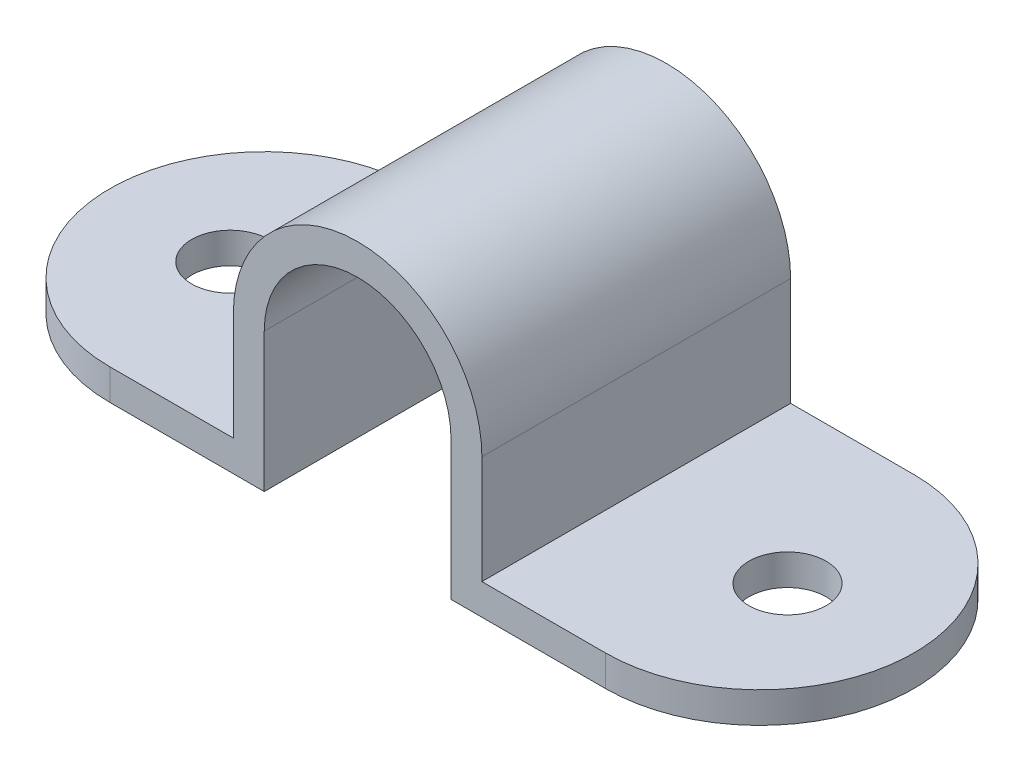
ISO-10303-21;
HEADER;
FILE_DESCRIPTION(('STEP AP214'),'2;1');
FILE_NAME('part.step','',(''),(''),'','','');
FILE_SCHEMA(('AUTOMOTIVE_DESIGN { 1 0 10303 214 1 1 1 1 }'));
ENDSEC;
DATA;
#1=APPLICATION_CONTEXT('core data for automotive mechanical design processes');
#2=APPLICATION_PROTOCOL_DEFINITION('international standard','automotive_design',2000,#1);
#3=PRODUCT_CONTEXT('',#1,'mechanical');
#4=PRODUCT('Part','Part','',(#3));
#5=PRODUCT_RELATED_PRODUCT_CATEGORY('part','',(#4));
#6=PRODUCT_DEFINITION_FORMATION('','',#4);
#7=PRODUCT_DEFINITION_CONTEXT('part definition',#1,'design');
#8=PRODUCT_DEFINITION('design','',#6,#7);
#9=PRODUCT_DEFINITION_SHAPE('','',#8);
#10=(LENGTH_UNIT() NAMED_UNIT(*) SI_UNIT(.MILLI.,.METRE.));
#11=(NAMED_UNIT(*) PLANE_ANGLE_UNIT() SI_UNIT($,.RADIAN.));
#12=(NAMED_UNIT(*) SI_UNIT($,.STERADIAN.) SOLID_ANGLE_UNIT());
#13=UNCERTAINTY_MEASURE_WITH_UNIT(LENGTH_MEASURE(1.E-05),#10,'distance_accuracy_value','');
#14=(GEOMETRIC_REPRESENTATION_CONTEXT(3) GLOBAL_UNCERTAINTY_ASSIGNED_CONTEXT((#13)) GLOBAL_UNIT_ASSIGNED_CONTEXT((#10,
#11,#12)) REPRESENTATION_CONTEXT('',''));
#15=CARTESIAN_POINT('',(0.,0.,0.));
#16=DIRECTION('',(0.,0.,1.));
#17=DIRECTION('',(1.,0.,0.));
#18=AXIS2_PLACEMENT_3D('',#15,#16,#17);
#19=CARTESIAN_POINT('',(-6.05,-9.,20.));
#20=DIRECTION('',(0.,1.,0.));
#21=DIRECTION('',(-1.,0.,0.));
#22=AXIS2_PLACEMENT_3D('',#19,#20,#21);
#23=PLANE('',#22);
#24=CARTESIAN_POINT('',(-18.05,-9.,10.2020410288673));
#25=DIRECTION('',(0.,1.,0.));
#26=DIRECTION('',(-1.,0.,0.));
#27=AXIS2_PLACEMENT_3D('',#24,#25,#26);
#28=CIRCLE('',#27,2.5);
#29=CARTESIAN_POINT('',(-20.55,-9.,10.2020410288673));
#30=VERTEX_POINT('',#29);
#31=EDGE_CURVE('E243',#30,#30,#28,.T.);
#32=ORIENTED_EDGE('',*,*,#31,.T.);
#33=EDGE_LOOP('',(#32));
#34=FACE_BOUND('',#33,.T.);
#35=DIRECTION('',(1.,0.,0.));
#36=VECTOR('',#35,1.);
#37=CARTESIAN_POINT('',(-6.05,-9.,0.));
#38=LINE('',#37,#36);
#39=CARTESIAN_POINT('',(-16.05,-9.,0.));
#40=VERTEX_POINT('',#39);
#41=CARTESIAN_POINT('',(-6.05,-9.,0.));
#42=VERTEX_POINT('',#41);
#43=EDGE_CURVE('E149',#40,#42,#38,.T.);
#44=ORIENTED_EDGE('',*,*,#43,.T.);
#45=DIRECTION('',(0.,0.,-1.));
#46=VECTOR('',#45,1.);
#47=CARTESIAN_POINT('',(-6.05,-9.,20.));
#48=LINE('',#47,#46);
#49=CARTESIAN_POINT('',(-6.05,-9.,20.));
#50=VERTEX_POINT('',#49);
#51=EDGE_CURVE('E11',#50,#42,#48,.T.);
#52=ORIENTED_EDGE('',*,*,#51,.F.);
#53=DIRECTION('',(1.,0.,0.));
#54=VECTOR('',#53,1.);
#55=CARTESIAN_POINT('',(-6.05,-9.,20.));
#56=LINE('',#55,#54);
#57=CARTESIAN_POINT('',(-16.05,-9.,20.));
#58=VERTEX_POINT('',#57);
#59=EDGE_CURVE('E174',#58,#50,#56,.T.);
#60=ORIENTED_EDGE('',*,*,#59,.F.);
#61=CARTESIAN_POINT('',(-16.05,-9.,10.));
#62=DIRECTION('',(0.,-1.,0.));
#63=DIRECTION('',(0.,0.,-1.));
#64=AXIS2_PLACEMENT_3D('',#61,#62,#63);
#65=CIRCLE('',#64,10.);
#66=EDGE_CURVE('E237',#58,#40,#65,.T.);
#67=ORIENTED_EDGE('',*,*,#66,.T.);
#68=EDGE_LOOP('',(#44,#52,#60,#67));
#69=FACE_BOUND('',#68,.T.);
#70=ADVANCED_FACE('F36',(#34,#69),#23,.F.);
#71=CARTESIAN_POINT('',(-6.05,0.,20.));
#72=DIRECTION('',(-1.,0.,0.));
#73=DIRECTION('',(0.,-1.,0.));
#74=AXIS2_PLACEMENT_3D('',#71,#72,#73);
#75=PLANE('',#74);
#76=DIRECTION('',(0.,1.,0.));
#77=VECTOR('',#76,1.);
#78=CARTESIAN_POINT('',(-6.05,0.,0.));
#79=LINE('',#78,#77);
#80=CARTESIAN_POINT('',(-6.05,0.,0.));
#81=VERTEX_POINT('',#80);
#82=EDGE_CURVE('E152',#42,#81,#79,.T.);
#83=ORIENTED_EDGE('',*,*,#82,.T.);
#84=DIRECTION('',(0.,0.,-1.));
#85=VECTOR('',#84,1.);
#86=CARTESIAN_POINT('',(-6.05,0.,20.));
#87=LINE('',#86,#85);
#88=CARTESIAN_POINT('',(-6.05,0.,20.));
#89=VERTEX_POINT('',#88);
#90=EDGE_CURVE('E44',#89,#81,#87,.T.);
#91=ORIENTED_EDGE('',*,*,#90,.F.);
#92=DIRECTION('',(0.,1.,0.));
#93=VECTOR('',#92,1.);
#94=CARTESIAN_POINT('',(-6.05,0.,20.));
#95=LINE('',#94,#93);
#96=EDGE_CURVE('E103',#50,#89,#95,.T.);
#97=ORIENTED_EDGE('',*,*,#96,.F.);
#98=ORIENTED_EDGE('',*,*,#51,.T.);
#99=EDGE_LOOP('',(#83,#91,#97,#98));
#100=FACE_BOUND('',#99,.T.);
#101=ADVANCED_FACE('F252',(#100),#75,.F.);
#102=CARTESIAN_POINT('',(0.,0.,20.));
#103=DIRECTION('',(0.,0.,-1.));
#104=DIRECTION('',(-1.,0.,0.));
#105=AXIS2_PLACEMENT_3D('',#102,#103,#104);
#106=CYLINDRICAL_SURFACE('',#105,6.05);
#107=CARTESIAN_POINT('',(0.,0.,0.));
#108=DIRECTION('',(0.,0.,-1.));
#109=DIRECTION('',(1.,0.,0.));
#110=AXIS2_PLACEMENT_3D('',#107,#108,#109);
#111=CIRCLE('',#110,6.05);
#112=CARTESIAN_POINT('',(6.05,0.,0.));
#113=VERTEX_POINT('',#112);
#114=EDGE_CURVE('E155',#81,#113,#111,.T.);
#115=ORIENTED_EDGE('',*,*,#114,.T.);
#116=DIRECTION('',(0.,0.,-1.));
#117=VECTOR('',#116,1.);
#118=CARTESIAN_POINT('',(6.05,0.,20.));
#119=LINE('',#118,#117);
#120=CARTESIAN_POINT('',(6.05,0.,20.));
#121=VERTEX_POINT('',#120);
#122=EDGE_CURVE('E186',#121,#113,#119,.T.);
#123=ORIENTED_EDGE('',*,*,#122,.F.);
#124=CARTESIAN_POINT('',(0.,0.,20.));
#125=DIRECTION('',(0.,0.,-1.));
#126=DIRECTION('',(1.,0.,0.));
#127=AXIS2_PLACEMENT_3D('',#124,#125,#126);
#128=CIRCLE('',#127,6.05);
#129=EDGE_CURVE('E194',#89,#121,#128,.T.);
#130=ORIENTED_EDGE('',*,*,#129,.F.);
#131=ORIENTED_EDGE('',*,*,#90,.T.);
#132=EDGE_LOOP('',(#115,#123,#130,#131));
#133=FACE_BOUND('',#132,.T.);
#134=ADVANCED_FACE('F192',(#133),#106,.F.);
#135=CARTESIAN_POINT('',(6.05,0.,20.));
#136=DIRECTION('',(1.,0.,0.));
#137=DIRECTION('',(0.,1.,0.));
#138=AXIS2_PLACEMENT_3D('',#135,#136,#137);
#139=PLANE('',#138);
#140=DIRECTION('',(0.,-1.,0.));
#141=VECTOR('',#140,1.);
#142=CARTESIAN_POINT('',(6.05,0.,0.));
#143=LINE('',#142,#141);
#144=CARTESIAN_POINT('',(6.05,-9.,0.));
#145=VERTEX_POINT('',#144);
#146=EDGE_CURVE('E157',#113,#145,#143,.T.);
#147=ORIENTED_EDGE('',*,*,#146,.T.);
#148=DIRECTION('',(0.,0.,-1.));
#149=VECTOR('',#148,1.);
#150=CARTESIAN_POINT('',(6.05,-9.,20.));
#151=LINE('',#150,#149);
#152=CARTESIAN_POINT('',(6.05,-9.,20.));
#153=VERTEX_POINT('',#152);
#154=EDGE_CURVE('E183',#153,#145,#151,.T.);
#155=ORIENTED_EDGE('',*,*,#154,.F.);
#156=DIRECTION('',(0.,-1.,0.));
#157=VECTOR('',#156,1.);
#158=CARTESIAN_POINT('',(6.05,0.,20.));
#159=LINE('',#158,#157);
#160=EDGE_CURVE('E213',#121,#153,#159,.T.);
#161=ORIENTED_EDGE('',*,*,#160,.F.);
#162=ORIENTED_EDGE('',*,*,#122,.T.);
#163=EDGE_LOOP('',(#147,#155,#161,#162));
#164=FACE_BOUND('',#163,.T.);
#165=ADVANCED_FACE('F203',(#164),#139,.F.);
#166=CARTESIAN_POINT('',(6.05,-9.,20.));
#167=DIRECTION('',(0.,1.,0.));
#168=DIRECTION('',(-1.,0.,0.));
#169=AXIS2_PLACEMENT_3D('',#166,#167,#168);
#170=PLANE('',#169);
#171=CARTESIAN_POINT('',(18.05,-9.,10.2020410288673));
#172=DIRECTION('',(0.,1.,0.));
#173=DIRECTION('',(-1.,0.,0.));
#174=AXIS2_PLACEMENT_3D('',#171,#172,#173);
#175=CIRCLE('',#174,2.5);
#176=CARTESIAN_POINT('',(15.55,-9.,10.2020410288673));
#177=VERTEX_POINT('',#176);
#178=EDGE_CURVE('E238',#177,#177,#175,.T.);
#179=ORIENTED_EDGE('',*,*,#178,.T.);
#180=EDGE_LOOP('',(#179));
#181=FACE_BOUND('',#180,.T.);
#182=DIRECTION('',(1.,0.,0.));
#183=VECTOR('',#182,1.);
#184=CARTESIAN_POINT('',(6.05,-9.,0.));
#185=LINE('',#184,#183);
#186=CARTESIAN_POINT('',(16.05,-9.,0.));
#187=VERTEX_POINT('',#186);
#188=EDGE_CURVE('E159',#145,#187,#185,.T.);
#189=ORIENTED_EDGE('',*,*,#188,.T.);
#190=CARTESIAN_POINT('',(16.05,-9.,10.));
#191=DIRECTION('',(0.,1.,0.));
#192=DIRECTION('',(0.,0.,-1.));
#193=AXIS2_PLACEMENT_3D('',#190,#191,#192);
#194=CIRCLE('',#193,10.);
#195=CARTESIAN_POINT('',(16.05,-9.,20.));
#196=VERTEX_POINT('',#195);
#197=EDGE_CURVE('E153',#196,#187,#194,.T.);
#198=ORIENTED_EDGE('',*,*,#197,.F.);
#199=DIRECTION('',(1.,0.,0.));
#200=VECTOR('',#199,1.);
#201=CARTESIAN_POINT('',(6.05,-9.,20.));
#202=LINE('',#201,#200);
#203=EDGE_CURVE('E209',#153,#196,#202,.T.);
#204=ORIENTED_EDGE('',*,*,#203,.F.);
#205=ORIENTED_EDGE('',*,*,#154,.T.);
#206=EDGE_LOOP('',(#189,#198,#204,#205));
#207=FACE_BOUND('',#206,.T.);
#208=ADVANCED_FACE('F207',(#181,#207),#170,.F.);
#209=CARTESIAN_POINT('',(8.05,-7.,20.));
#210=DIRECTION('',(0.,-1.,0.));
#211=DIRECTION('',(0.,0.,-1.));
#212=AXIS2_PLACEMENT_3D('',#209,#210,#211);
#213=PLANE('',#212);
#214=CARTESIAN_POINT('',(18.05,-7.,10.2020410288673));
#215=DIRECTION('',(0.,1.,0.));
#216=DIRECTION('',(0.,0.,1.));
#217=AXIS2_PLACEMENT_3D('',#214,#215,#216);
#218=CIRCLE('',#217,2.5);
#219=CARTESIAN_POINT('',(18.05,-7.,12.7020410288673));
#220=VERTEX_POINT('',#219);
#221=EDGE_CURVE('E301',#220,#220,#218,.T.);
#222=ORIENTED_EDGE('',*,*,#221,.F.);
#223=EDGE_LOOP('',(#222));
#224=FACE_BOUND('',#223,.T.);
#225=DIRECTION('',(-1.,0.,0.));
#226=VECTOR('',#225,1.);
#227=CARTESIAN_POINT('',(8.05,-7.,0.));
#228=LINE('',#227,#226);
#229=CARTESIAN_POINT('',(16.05,-7.,0.));
#230=VERTEX_POINT('',#229);
#231=CARTESIAN_POINT('',(8.05,-7.,0.));
#232=VERTEX_POINT('',#231);
#233=EDGE_CURVE('E164',#230,#232,#228,.T.);
#234=ORIENTED_EDGE('',*,*,#233,.T.);
#235=DIRECTION('',(0.,0.,-1.));
#236=VECTOR('',#235,1.);
#237=CARTESIAN_POINT('',(8.05,-7.,20.));
#238=LINE('',#237,#236);
#239=CARTESIAN_POINT('',(8.05,-7.,20.));
#240=VERTEX_POINT('',#239);
#241=EDGE_CURVE('E180',#240,#232,#238,.T.);
#242=ORIENTED_EDGE('',*,*,#241,.F.);
#243=DIRECTION('',(-1.,0.,0.));
#244=VECTOR('',#243,1.);
#245=CARTESIAN_POINT('',(8.05,-7.,20.));
#246=LINE('',#245,#244);
#247=CARTESIAN_POINT('',(16.05,-7.,20.));
#248=VERTEX_POINT('',#247);
#249=EDGE_CURVE('E215',#248,#240,#246,.T.);
#250=ORIENTED_EDGE('',*,*,#249,.F.);
#251=CARTESIAN_POINT('',(16.05,-7.,10.));
#252=DIRECTION('',(0.,1.,0.));
#253=DIRECTION('',(0.,0.,-1.));
#254=AXIS2_PLACEMENT_3D('',#251,#252,#253);
#255=CIRCLE('',#254,10.);
#256=EDGE_CURVE('E240',#248,#230,#255,.T.);
#257=ORIENTED_EDGE('',*,*,#256,.T.);
#258=EDGE_LOOP('',(#234,#242,#250,#257));
#259=FACE_BOUND('',#258,.T.);
#260=ADVANCED_FACE('F265',(#224,#259),#213,.F.);
#261=CARTESIAN_POINT('',(8.05,0.,20.));
#262=DIRECTION('',(-1.,0.,0.));
#263=DIRECTION('',(0.,0.,1.));
#264=AXIS2_PLACEMENT_3D('',#261,#262,#263);
#265=PLANE('',#264);
#266=DIRECTION('',(0.,1.,0.));
#267=VECTOR('',#266,1.);
#268=CARTESIAN_POINT('',(8.05,0.,0.));
#269=LINE('',#268,#267);
#270=CARTESIAN_POINT('',(8.05,0.,0.));
#271=VERTEX_POINT('',#270);
#272=EDGE_CURVE('E166',#232,#271,#269,.T.);
#273=ORIENTED_EDGE('',*,*,#272,.T.);
#274=DIRECTION('',(0.,0.,-1.));
#275=VECTOR('',#274,1.);
#276=CARTESIAN_POINT('',(8.05,0.,20.));
#277=LINE('',#276,#275);
#278=CARTESIAN_POINT('',(8.05,0.,20.));
#279=VERTEX_POINT('',#278);
#280=EDGE_CURVE('E177',#279,#271,#277,.T.);
#281=ORIENTED_EDGE('',*,*,#280,.F.);
#282=DIRECTION('',(0.,1.,0.));
#283=VECTOR('',#282,1.);
#284=CARTESIAN_POINT('',(8.05,0.,20.));
#285=LINE('',#284,#283);
#286=EDGE_CURVE('E221',#240,#279,#285,.T.);
#287=ORIENTED_EDGE('',*,*,#286,.F.);
#288=ORIENTED_EDGE('',*,*,#241,.T.);
#289=EDGE_LOOP('',(#273,#281,#287,#288));
#290=FACE_BOUND('',#289,.T.);
#291=ADVANCED_FACE('F227',(#290),#265,.F.);
#292=CARTESIAN_POINT('',(0.,0.,20.));
#293=DIRECTION('',(0.,0.,-1.));
#294=DIRECTION('',(-1.,0.,0.));
#295=AXIS2_PLACEMENT_3D('',#292,#293,#294);
#296=CYLINDRICAL_SURFACE('',#295,8.05);
#297=CARTESIAN_POINT('',(0.,0.,0.));
#298=DIRECTION('',(0.,0.,1.));
#299=DIRECTION('',(1.,0.,0.));
#300=AXIS2_PLACEMENT_3D('',#297,#298,#299);
#301=CIRCLE('',#300,8.05);
#302=CARTESIAN_POINT('',(-8.05,0.,0.));
#303=VERTEX_POINT('',#302);
#304=EDGE_CURVE('E168',#271,#303,#301,.T.);
#305=ORIENTED_EDGE('',*,*,#304,.T.);
#306=DIRECTION('',(0.,0.,-1.));
#307=VECTOR('',#306,1.);
#308=CARTESIAN_POINT('',(-8.05,0.,20.));
#309=LINE('',#308,#307);
#310=CARTESIAN_POINT('',(-8.05,0.,20.));
#311=VERTEX_POINT('',#310);
#312=EDGE_CURVE('E140',#311,#303,#309,.T.);
#313=ORIENTED_EDGE('',*,*,#312,.F.);
#314=CARTESIAN_POINT('',(0.,0.,20.));
#315=DIRECTION('',(0.,0.,1.));
#316=DIRECTION('',(1.,0.,0.));
#317=AXIS2_PLACEMENT_3D('',#314,#315,#316);
#318=CIRCLE('',#317,8.05);
#319=EDGE_CURVE('E135',#279,#311,#318,.T.);
#320=ORIENTED_EDGE('',*,*,#319,.F.);
#321=ORIENTED_EDGE('',*,*,#280,.T.);
#322=EDGE_LOOP('',(#305,#313,#320,#321));
#323=FACE_BOUND('',#322,.T.);
#324=ADVANCED_FACE('F231',(#323),#296,.T.);
#325=CARTESIAN_POINT('',(-8.05,0.,20.));
#326=DIRECTION('',(1.,0.,0.));
#327=DIRECTION('',(0.,0.,-1.));
#328=AXIS2_PLACEMENT_3D('',#325,#326,#327);
#329=PLANE('',#328);
#330=DIRECTION('',(0.,-1.,0.));
#331=VECTOR('',#330,1.);
#332=CARTESIAN_POINT('',(-8.05,0.,0.));
#333=LINE('',#332,#331);
#334=CARTESIAN_POINT('',(-8.05,-7.,0.));
#335=VERTEX_POINT('',#334);
#336=EDGE_CURVE('E88',#303,#335,#333,.T.);
#337=ORIENTED_EDGE('',*,*,#336,.T.);
#338=DIRECTION('',(0.,0.,-1.));
#339=VECTOR('',#338,1.);
#340=CARTESIAN_POINT('',(-8.05,-7.,20.));
#341=LINE('',#340,#339);
#342=CARTESIAN_POINT('',(-8.05,-7.,20.));
#343=VERTEX_POINT('',#342);
#344=EDGE_CURVE('E138',#343,#335,#341,.T.);
#345=ORIENTED_EDGE('',*,*,#344,.F.);
#346=DIRECTION('',(0.,-1.,0.));
#347=VECTOR('',#346,1.);
#348=CARTESIAN_POINT('',(-8.05,0.,20.));
#349=LINE('',#348,#347);
#350=EDGE_CURVE('E130',#311,#343,#349,.T.);
#351=ORIENTED_EDGE('',*,*,#350,.F.);
#352=ORIENTED_EDGE('',*,*,#312,.T.);
#353=EDGE_LOOP('',(#337,#345,#351,#352));
#354=FACE_BOUND('',#353,.T.);
#355=ADVANCED_FACE('F139',(#354),#329,.F.);
#356=CARTESIAN_POINT('',(-8.05,-7.,20.));
#357=DIRECTION('',(0.,-1.,0.));
#358=DIRECTION('',(1.,0.,0.));
#359=AXIS2_PLACEMENT_3D('',#356,#357,#358);
#360=PLANE('',#359);
#361=CARTESIAN_POINT('',(-18.05,-7.,10.2020410288673));
#362=DIRECTION('',(0.,1.,0.));
#363=DIRECTION('',(0.,0.,1.));
#364=AXIS2_PLACEMENT_3D('',#361,#362,#363);
#365=CIRCLE('',#364,2.5);
#366=CARTESIAN_POINT('',(-18.05,-7.,12.7020410288673));
#367=VERTEX_POINT('',#366);
#368=EDGE_CURVE('E303',#367,#367,#365,.T.);
#369=ORIENTED_EDGE('',*,*,#368,.F.);
#370=EDGE_LOOP('',(#369));
#371=FACE_BOUND('',#370,.T.);
#372=DIRECTION('',(-1.,0.,0.));
#373=VECTOR('',#372,1.);
#374=CARTESIAN_POINT('',(-8.05,-7.,0.));
#375=LINE('',#374,#373);
#376=CARTESIAN_POINT('',(-16.05,-7.,0.));
#377=VERTEX_POINT('',#376);
#378=EDGE_CURVE('E95',#335,#377,#375,.T.);
#379=ORIENTED_EDGE('',*,*,#378,.T.);
#380=CARTESIAN_POINT('',(-16.05,-7.,10.));
#381=DIRECTION('',(0.,-1.,0.));
#382=DIRECTION('',(0.,0.,-1.));
#383=AXIS2_PLACEMENT_3D('',#380,#381,#382);
#384=CIRCLE('',#383,10.);
#385=CARTESIAN_POINT('',(-16.05,-7.,20.));
#386=VERTEX_POINT('',#385);
#387=EDGE_CURVE('E144',#386,#377,#384,.T.);
#388=ORIENTED_EDGE('',*,*,#387,.F.);
#389=DIRECTION('',(-1.,0.,0.));
#390=VECTOR('',#389,1.);
#391=CARTESIAN_POINT('',(-8.05,-7.,20.));
#392=LINE('',#391,#390);
#393=EDGE_CURVE('E133',#343,#386,#392,.T.);
#394=ORIENTED_EDGE('',*,*,#393,.F.);
#395=ORIENTED_EDGE('',*,*,#344,.T.);
#396=EDGE_LOOP('',(#379,#388,#394,#395));
#397=FACE_BOUND('',#396,.T.);
#398=ADVANCED_FACE('F142',(#371,#397),#360,.F.);
#399=CARTESIAN_POINT('',(0.,0.,20.));
#400=DIRECTION('',(0.,0.,1.));
#401=DIRECTION('',(1.,0.,0.));
#402=AXIS2_PLACEMENT_3D('',#399,#400,#401);
#403=PLANE('',#402);
#404=ORIENTED_EDGE('',*,*,#59,.T.);
#405=ORIENTED_EDGE('',*,*,#96,.T.);
#406=ORIENTED_EDGE('',*,*,#129,.T.);
#407=ORIENTED_EDGE('',*,*,#160,.T.);
#408=ORIENTED_EDGE('',*,*,#203,.T.);
#409=DIRECTION('',(0.,1.,0.));
#410=VECTOR('',#409,1.);
#411=CARTESIAN_POINT('',(16.05,-9.,20.));
#412=LINE('',#411,#410);
#413=EDGE_CURVE('E212',#196,#248,#412,.T.);
#414=ORIENTED_EDGE('',*,*,#413,.T.);
#415=ORIENTED_EDGE('',*,*,#249,.T.);
#416=ORIENTED_EDGE('',*,*,#286,.T.);
#417=ORIENTED_EDGE('',*,*,#319,.T.);
#418=ORIENTED_EDGE('',*,*,#350,.T.);
#419=ORIENTED_EDGE('',*,*,#393,.T.);
#420=DIRECTION('',(0.,-1.,0.));
#421=VECTOR('',#420,1.);
#422=CARTESIAN_POINT('',(-16.05,-9.,20.));
#423=LINE('',#422,#421);
#424=EDGE_CURVE('E52',#386,#58,#423,.T.);
#425=ORIENTED_EDGE('',*,*,#424,.T.);
#426=EDGE_LOOP('',(#404,#405,#406,#407,#408,#414,#415,#416,#417,#418,#419,#425));
#427=FACE_BOUND('',#426,.T.);
#428=ADVANCED_FACE('F131',(#427),#403,.T.);
#429=CARTESIAN_POINT('',(0.,0.,0.));
#430=DIRECTION('',(0.,0.,1.));
#431=DIRECTION('',(1.,0.,0.));
#432=AXIS2_PLACEMENT_3D('',#429,#430,#431);
#433=PLANE('',#432);
#434=ORIENTED_EDGE('',*,*,#43,.F.);
#435=DIRECTION('',(0.,-1.,0.));
#436=VECTOR('',#435,1.);
#437=CARTESIAN_POINT('',(-16.05,-9.,0.));
#438=LINE('',#437,#436);
#439=EDGE_CURVE('E172',#377,#40,#438,.T.);
#440=ORIENTED_EDGE('',*,*,#439,.F.);
#441=ORIENTED_EDGE('',*,*,#378,.F.);
#442=ORIENTED_EDGE('',*,*,#336,.F.);
#443=ORIENTED_EDGE('',*,*,#304,.F.);
#444=ORIENTED_EDGE('',*,*,#272,.F.);
#445=ORIENTED_EDGE('',*,*,#233,.F.);
#446=DIRECTION('',(0.,1.,0.));
#447=VECTOR('',#446,1.);
#448=CARTESIAN_POINT('',(16.05,-9.,0.));
#449=LINE('',#448,#447);
#450=EDGE_CURVE('E161',#187,#230,#449,.T.);
#451=ORIENTED_EDGE('',*,*,#450,.F.);
#452=ORIENTED_EDGE('',*,*,#188,.F.);
#453=ORIENTED_EDGE('',*,*,#146,.F.);
#454=ORIENTED_EDGE('',*,*,#114,.F.);
#455=ORIENTED_EDGE('',*,*,#82,.F.);
#456=EDGE_LOOP('',(#434,#440,#441,#442,#443,#444,#445,#451,#452,#453,#454,#455));
#457=FACE_BOUND('',#456,.T.);
#458=ADVANCED_FACE('F198',(#457),#433,.F.);
#459=CARTESIAN_POINT('',(16.05,-9.,10.));
#460=DIRECTION('',(0.,1.,0.));
#461=DIRECTION('',(0.,0.,1.));
#462=AXIS2_PLACEMENT_3D('',#459,#460,#461);
#463=CYLINDRICAL_SURFACE('',#462,10.);
#464=ORIENTED_EDGE('',*,*,#256,.F.);
#465=ORIENTED_EDGE('',*,*,#413,.F.);
#466=ORIENTED_EDGE('',*,*,#197,.T.);
#467=ORIENTED_EDGE('',*,*,#450,.T.);
#468=EDGE_LOOP('',(#464,#465,#466,#467));
#469=FACE_BOUND('',#468,.T.);
#470=ADVANCED_FACE('F281',(#469),#463,.T.);
#471=CARTESIAN_POINT('',(-16.05,-9.,10.));
#472=DIRECTION('',(0.,1.,0.));
#473=DIRECTION('',(0.,0.,1.));
#474=AXIS2_PLACEMENT_3D('',#471,#472,#473);
#475=CYLINDRICAL_SURFACE('',#474,10.);
#476=ORIENTED_EDGE('',*,*,#387,.T.);
#477=ORIENTED_EDGE('',*,*,#439,.T.);
#478=ORIENTED_EDGE('',*,*,#66,.F.);
#479=ORIENTED_EDGE('',*,*,#424,.F.);
#480=EDGE_LOOP('',(#476,#477,#478,#479));
#481=FACE_BOUND('',#480,.T.);
#482=ADVANCED_FACE('F236',(#481),#475,.T.);
#483=CARTESIAN_POINT('',(-18.05,-17.,10.2020410288673));
#484=DIRECTION('',(0.,1.,0.));
#485=DIRECTION('',(0.,0.,1.));
#486=AXIS2_PLACEMENT_3D('',#483,#484,#485);
#487=CYLINDRICAL_SURFACE('',#486,2.5);
#488=ORIENTED_EDGE('',*,*,#368,.T.);
#489=EDGE_LOOP('',(#488));
#490=FACE_BOUND('',#489,.T.);
#491=ORIENTED_EDGE('',*,*,#31,.F.);
#492=EDGE_LOOP('',(#491));
#493=FACE_BOUND('',#492,.T.);
#494=ADVANCED_FACE('F289',(#490,#493),#487,.F.);
#495=CARTESIAN_POINT('',(18.05,-17.,10.2020410288673));
#496=DIRECTION('',(0.,1.,0.));
#497=DIRECTION('',(0.,0.,1.));
#498=AXIS2_PLACEMENT_3D('',#495,#496,#497);
#499=CYLINDRICAL_SURFACE('',#498,2.5);
#500=ORIENTED_EDGE('',*,*,#221,.T.);
#501=EDGE_LOOP('',(#500));
#502=FACE_BOUND('',#501,.T.);
#503=ORIENTED_EDGE('',*,*,#178,.F.);
#504=EDGE_LOOP('',(#503));
#505=FACE_BOUND('',#504,.T.);
#506=ADVANCED_FACE('F292',(#502,#505),#499,.F.);
#507=CLOSED_SHELL('',(#70,#101,#134,#165,#208,#260,#291,#324,#355,#398,#428,#458,#470,#482,#494,#506));
#508=MANIFOLD_SOLID_BREP('B2',#507);
#509=ADVANCED_BREP_SHAPE_REPRESENTATION('',(#18,#508),#14);
#510=SHAPE_DEFINITION_REPRESENTATION(#9,#509);
ENDSEC;
END-ISO-10303-21;
